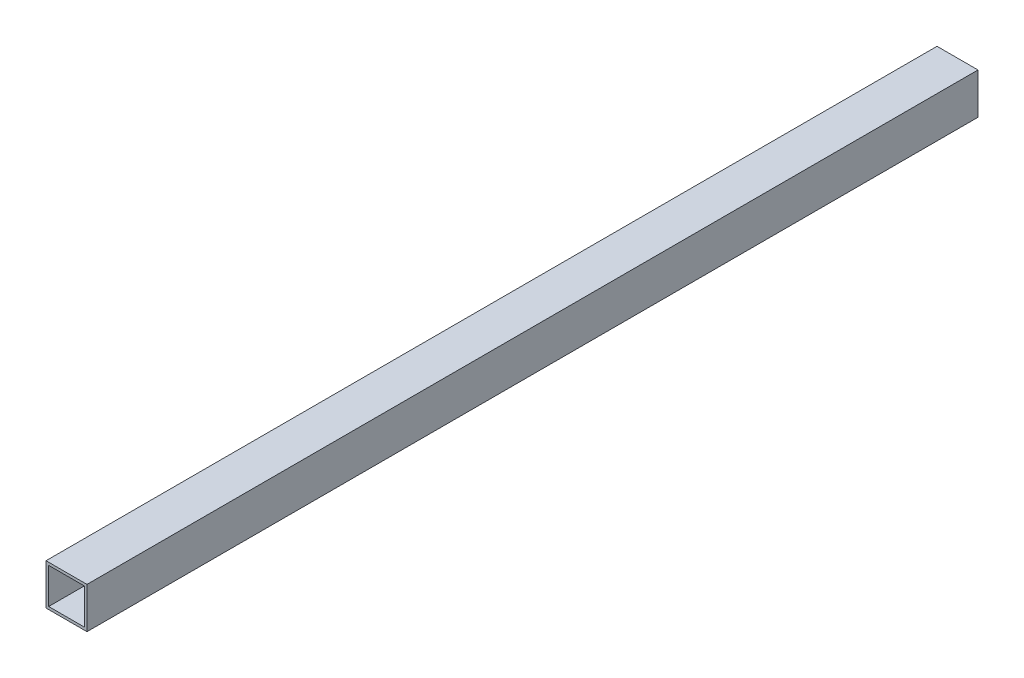
ISO-10303-21;
HEADER;
FILE_DESCRIPTION(('STEP AP214'),'2;1');
FILE_NAME('part.step','',(''),(''),'','','');
FILE_SCHEMA(('AUTOMOTIVE_DESIGN { 1 0 10303 214 1 1 1 1 }'));
ENDSEC;
DATA;
#1=APPLICATION_CONTEXT('core data for automotive mechanical design processes');
#2=APPLICATION_PROTOCOL_DEFINITION('international standard','automotive_design',2000,#1);
#3=PRODUCT_CONTEXT('',#1,'mechanical');
#4=PRODUCT('Part','Part','',(#3));
#5=PRODUCT_RELATED_PRODUCT_CATEGORY('part','',(#4));
#6=PRODUCT_DEFINITION_FORMATION('','',#4);
#7=PRODUCT_DEFINITION_CONTEXT('part definition',#1,'design');
#8=PRODUCT_DEFINITION('design','',#6,#7);
#9=PRODUCT_DEFINITION_SHAPE('','',#8);
#10=(LENGTH_UNIT() NAMED_UNIT(*) SI_UNIT(.MILLI.,.METRE.));
#11=(NAMED_UNIT(*) PLANE_ANGLE_UNIT() SI_UNIT($,.RADIAN.));
#12=(NAMED_UNIT(*) SI_UNIT($,.STERADIAN.) SOLID_ANGLE_UNIT());
#13=UNCERTAINTY_MEASURE_WITH_UNIT(LENGTH_MEASURE(1.E-05),#10,'distance_accuracy_value','');
#14=(GEOMETRIC_REPRESENTATION_CONTEXT(3) GLOBAL_UNCERTAINTY_ASSIGNED_CONTEXT((#13)) GLOBAL_UNIT_ASSIGNED_CONTEXT((#10,
#11,#12)) REPRESENTATION_CONTEXT('',''));
#15=CARTESIAN_POINT('',(0.,0.,0.));
#16=DIRECTION('',(0.,0.,1.));
#17=DIRECTION('',(1.,0.,0.));
#18=AXIS2_PLACEMENT_3D('',#15,#16,#17);
#19=CARTESIAN_POINT('',(0.,0.,1000.));
#20=DIRECTION('',(0.,0.,-1.));
#21=DIRECTION('',(-1.,0.,0.));
#22=AXIS2_PLACEMENT_3D('',#19,#20,#21);
#23=PLANE('',#22);
#24=DIRECTION('',(0.,-1.,0.));
#25=VECTOR('',#24,1.);
#26=CARTESIAN_POINT('',(-23.,-23.,1000.));
#27=LINE('',#26,#25);
#28=CARTESIAN_POINT('',(-23.,23.,1000.));
#29=VERTEX_POINT('',#28);
#30=CARTESIAN_POINT('',(-23.,-23.,1000.));
#31=VERTEX_POINT('',#30);
#32=EDGE_CURVE('E159',#29,#31,#27,.T.);
#33=ORIENTED_EDGE('',*,*,#32,.T.);
#34=DIRECTION('',(1.,0.,0.));
#35=VECTOR('',#34,1.);
#36=CARTESIAN_POINT('',(-23.,-23.,1000.));
#37=LINE('',#36,#35);
#38=CARTESIAN_POINT('',(23.,-23.,1000.));
#39=VERTEX_POINT('',#38);
#40=EDGE_CURVE('E163',#31,#39,#37,.T.);
#41=ORIENTED_EDGE('',*,*,#40,.T.);
#42=DIRECTION('',(0.,1.,0.));
#43=VECTOR('',#42,1.);
#44=CARTESIAN_POINT('',(23.,-23.,1000.));
#45=LINE('',#44,#43);
#46=CARTESIAN_POINT('',(23.,23.,1000.));
#47=VERTEX_POINT('',#46);
#48=EDGE_CURVE('E167',#39,#47,#45,.T.);
#49=ORIENTED_EDGE('',*,*,#48,.T.);
#50=DIRECTION('',(-1.,0.,0.));
#51=VECTOR('',#50,1.);
#52=CARTESIAN_POINT('',(-23.,23.,1000.));
#53=LINE('',#52,#51);
#54=EDGE_CURVE('E170',#47,#29,#53,.T.);
#55=ORIENTED_EDGE('',*,*,#54,.T.);
#56=EDGE_LOOP('',(#33,#41,#49,#55));
#57=FACE_BOUND('',#56,.T.);
#58=DIRECTION('',(0.,1.,0.));
#59=VECTOR('',#58,1.);
#60=CARTESIAN_POINT('',(20.,-20.,1000.));
#61=LINE('',#60,#59);
#62=CARTESIAN_POINT('',(20.,-20.,1000.));
#63=VERTEX_POINT('',#62);
#64=CARTESIAN_POINT('',(20.,20.,1000.));
#65=VERTEX_POINT('',#64);
#66=EDGE_CURVE('E111',#63,#65,#61,.T.);
#67=ORIENTED_EDGE('',*,*,#66,.F.);
#68=DIRECTION('',(1.,0.,0.));
#69=VECTOR('',#68,1.);
#70=CARTESIAN_POINT('',(-20.,-20.,1000.));
#71=LINE('',#70,#69);
#72=CARTESIAN_POINT('',(-20.,-20.,1000.));
#73=VERTEX_POINT('',#72);
#74=EDGE_CURVE('E137',#73,#63,#71,.T.);
#75=ORIENTED_EDGE('',*,*,#74,.F.);
#76=DIRECTION('',(0.,-1.,0.));
#77=VECTOR('',#76,1.);
#78=CARTESIAN_POINT('',(-20.,-20.,1000.));
#79=LINE('',#78,#77);
#80=CARTESIAN_POINT('',(-20.,20.,1000.));
#81=VERTEX_POINT('',#80);
#82=EDGE_CURVE('E133',#81,#73,#79,.T.);
#83=ORIENTED_EDGE('',*,*,#82,.F.);
#84=DIRECTION('',(-1.,0.,0.));
#85=VECTOR('',#84,1.);
#86=CARTESIAN_POINT('',(-20.,20.,1000.));
#87=LINE('',#86,#85);
#88=EDGE_CURVE('E120',#65,#81,#87,.T.);
#89=ORIENTED_EDGE('',*,*,#88,.F.);
#90=EDGE_LOOP('',(#67,#75,#83,#89));
#91=FACE_BOUND('',#90,.T.);
#92=ADVANCED_FACE('F45',(#57,#91),#23,.F.);
#93=CARTESIAN_POINT('',(0.,0.,0.));
#94=DIRECTION('',(0.,0.,-1.));
#95=DIRECTION('',(-1.,0.,0.));
#96=AXIS2_PLACEMENT_3D('',#93,#94,#95);
#97=PLANE('',#96);
#98=DIRECTION('',(0.,-1.,0.));
#99=VECTOR('',#98,1.);
#100=CARTESIAN_POINT('',(-23.,-23.,0.));
#101=LINE('',#100,#99);
#102=CARTESIAN_POINT('',(-23.,23.,0.));
#103=VERTEX_POINT('',#102);
#104=CARTESIAN_POINT('',(-23.,-23.,0.));
#105=VERTEX_POINT('',#104);
#106=EDGE_CURVE('E129',#103,#105,#101,.T.);
#107=ORIENTED_EDGE('',*,*,#106,.F.);
#108=DIRECTION('',(-1.,0.,0.));
#109=VECTOR('',#108,1.);
#110=CARTESIAN_POINT('',(-23.,23.,0.));
#111=LINE('',#110,#109);
#112=CARTESIAN_POINT('',(23.,23.,0.));
#113=VERTEX_POINT('',#112);
#114=EDGE_CURVE('E164',#113,#103,#111,.T.);
#115=ORIENTED_EDGE('',*,*,#114,.F.);
#116=DIRECTION('',(0.,1.,0.));
#117=VECTOR('',#116,1.);
#118=CARTESIAN_POINT('',(23.,-23.,0.));
#119=LINE('',#118,#117);
#120=CARTESIAN_POINT('',(23.,-23.,0.));
#121=VERTEX_POINT('',#120);
#122=EDGE_CURVE('E180',#121,#113,#119,.T.);
#123=ORIENTED_EDGE('',*,*,#122,.F.);
#124=DIRECTION('',(1.,0.,0.));
#125=VECTOR('',#124,1.);
#126=CARTESIAN_POINT('',(-23.,-23.,0.));
#127=LINE('',#126,#125);
#128=EDGE_CURVE('E177',#105,#121,#127,.T.);
#129=ORIENTED_EDGE('',*,*,#128,.F.);
#130=EDGE_LOOP('',(#107,#115,#123,#129));
#131=FACE_BOUND('',#130,.T.);
#132=DIRECTION('',(1.,0.,0.));
#133=VECTOR('',#132,1.);
#134=CARTESIAN_POINT('',(-20.,-20.,0.));
#135=LINE('',#134,#133);
#136=CARTESIAN_POINT('',(-20.,-20.,0.));
#137=VERTEX_POINT('',#136);
#138=CARTESIAN_POINT('',(20.,-20.,0.));
#139=VERTEX_POINT('',#138);
#140=EDGE_CURVE('E121',#137,#139,#135,.T.);
#141=ORIENTED_EDGE('',*,*,#140,.T.);
#142=DIRECTION('',(0.,1.,0.));
#143=VECTOR('',#142,1.);
#144=CARTESIAN_POINT('',(20.,-20.,0.));
#145=LINE('',#144,#143);
#146=CARTESIAN_POINT('',(20.,20.,0.));
#147=VERTEX_POINT('',#146);
#148=EDGE_CURVE('E69',#139,#147,#145,.T.);
#149=ORIENTED_EDGE('',*,*,#148,.T.);
#150=DIRECTION('',(-1.,0.,0.));
#151=VECTOR('',#150,1.);
#152=CARTESIAN_POINT('',(-20.,20.,0.));
#153=LINE('',#152,#151);
#154=CARTESIAN_POINT('',(-20.,20.,0.));
#155=VERTEX_POINT('',#154);
#156=EDGE_CURVE('E127',#147,#155,#153,.T.);
#157=ORIENTED_EDGE('',*,*,#156,.T.);
#158=DIRECTION('',(0.,-1.,0.));
#159=VECTOR('',#158,1.);
#160=CARTESIAN_POINT('',(-20.,-20.,0.));
#161=LINE('',#160,#159);
#162=EDGE_CURVE('E146',#155,#137,#161,.T.);
#163=ORIENTED_EDGE('',*,*,#162,.T.);
#164=EDGE_LOOP('',(#141,#149,#157,#163));
#165=FACE_BOUND('',#164,.T.);
#166=ADVANCED_FACE('F203',(#131,#165),#97,.T.);
#167=CARTESIAN_POINT('',(-23.,-23.,1000.));
#168=DIRECTION('',(1.,0.,0.));
#169=DIRECTION('',(0.,0.,-1.));
#170=AXIS2_PLACEMENT_3D('',#167,#168,#169);
#171=PLANE('',#170);
#172=ORIENTED_EDGE('',*,*,#106,.T.);
#173=DIRECTION('',(0.,0.,-1.));
#174=VECTOR('',#173,1.);
#175=CARTESIAN_POINT('',(-23.,-23.,1000.));
#176=LINE('',#175,#174);
#177=EDGE_CURVE('E11',#31,#105,#176,.T.);
#178=ORIENTED_EDGE('',*,*,#177,.F.);
#179=ORIENTED_EDGE('',*,*,#32,.F.);
#180=DIRECTION('',(0.,0.,-1.));
#181=VECTOR('',#180,1.);
#182=CARTESIAN_POINT('',(-23.,23.,1000.));
#183=LINE('',#182,#181);
#184=EDGE_CURVE('E173',#29,#103,#183,.T.);
#185=ORIENTED_EDGE('',*,*,#184,.T.);
#186=EDGE_LOOP('',(#172,#178,#179,#185));
#187=FACE_BOUND('',#186,.T.);
#188=ADVANCED_FACE('F47',(#187),#171,.F.);
#189=CARTESIAN_POINT('',(-23.,-23.,1000.));
#190=DIRECTION('',(0.,1.,0.));
#191=DIRECTION('',(0.,0.,1.));
#192=AXIS2_PLACEMENT_3D('',#189,#190,#191);
#193=PLANE('',#192);
#194=ORIENTED_EDGE('',*,*,#128,.T.);
#195=DIRECTION('',(0.,0.,-1.));
#196=VECTOR('',#195,1.);
#197=CARTESIAN_POINT('',(23.,-23.,1000.));
#198=LINE('',#197,#196);
#199=EDGE_CURVE('E54',#39,#121,#198,.T.);
#200=ORIENTED_EDGE('',*,*,#199,.F.);
#201=ORIENTED_EDGE('',*,*,#40,.F.);
#202=ORIENTED_EDGE('',*,*,#177,.T.);
#203=EDGE_LOOP('',(#194,#200,#201,#202));
#204=FACE_BOUND('',#203,.T.);
#205=ADVANCED_FACE('F213',(#204),#193,.F.);
#206=CARTESIAN_POINT('',(23.,-23.,1000.));
#207=DIRECTION('',(-1.,0.,0.));
#208=DIRECTION('',(0.,-1.,0.));
#209=AXIS2_PLACEMENT_3D('',#206,#207,#208);
#210=PLANE('',#209);
#211=ORIENTED_EDGE('',*,*,#122,.T.);
#212=DIRECTION('',(0.,0.,-1.));
#213=VECTOR('',#212,1.);
#214=CARTESIAN_POINT('',(23.,23.,1000.));
#215=LINE('',#214,#213);
#216=EDGE_CURVE('E188',#47,#113,#215,.T.);
#217=ORIENTED_EDGE('',*,*,#216,.F.);
#218=ORIENTED_EDGE('',*,*,#48,.F.);
#219=ORIENTED_EDGE('',*,*,#199,.T.);
#220=EDGE_LOOP('',(#211,#217,#218,#219));
#221=FACE_BOUND('',#220,.T.);
#222=ADVANCED_FACE('F197',(#221),#210,.F.);
#223=CARTESIAN_POINT('',(-23.,23.,1000.));
#224=DIRECTION('',(0.,-1.,0.));
#225=DIRECTION('',(1.,0.,0.));
#226=AXIS2_PLACEMENT_3D('',#223,#224,#225);
#227=PLANE('',#226);
#228=ORIENTED_EDGE('',*,*,#114,.T.);
#229=ORIENTED_EDGE('',*,*,#184,.F.);
#230=ORIENTED_EDGE('',*,*,#54,.F.);
#231=ORIENTED_EDGE('',*,*,#216,.T.);
#232=EDGE_LOOP('',(#228,#229,#230,#231));
#233=FACE_BOUND('',#232,.T.);
#234=ADVANCED_FACE('F207',(#233),#227,.F.);
#235=CARTESIAN_POINT('',(20.,-20.,1000.));
#236=DIRECTION('',(-1.,0.,0.));
#237=DIRECTION('',(0.,0.,1.));
#238=AXIS2_PLACEMENT_3D('',#235,#236,#237);
#239=PLANE('',#238);
#240=ORIENTED_EDGE('',*,*,#148,.F.);
#241=DIRECTION('',(0.,0.,-1.));
#242=VECTOR('',#241,1.);
#243=CARTESIAN_POINT('',(20.,-20.,1000.));
#244=LINE('',#243,#242);
#245=EDGE_CURVE('E115',#63,#139,#244,.T.);
#246=ORIENTED_EDGE('',*,*,#245,.F.);
#247=ORIENTED_EDGE('',*,*,#66,.T.);
#248=DIRECTION('',(0.,0.,-1.));
#249=VECTOR('',#248,1.);
#250=CARTESIAN_POINT('',(20.,20.,1000.));
#251=LINE('',#250,#249);
#252=EDGE_CURVE('E114',#65,#147,#251,.T.);
#253=ORIENTED_EDGE('',*,*,#252,.T.);
#254=EDGE_LOOP('',(#240,#246,#247,#253));
#255=FACE_BOUND('',#254,.T.);
#256=ADVANCED_FACE('F113',(#255),#239,.T.);
#257=CARTESIAN_POINT('',(-20.,20.,1000.));
#258=DIRECTION('',(0.,-1.,0.));
#259=DIRECTION('',(0.,0.,-1.));
#260=AXIS2_PLACEMENT_3D('',#257,#258,#259);
#261=PLANE('',#260);
#262=ORIENTED_EDGE('',*,*,#156,.F.);
#263=ORIENTED_EDGE('',*,*,#252,.F.);
#264=ORIENTED_EDGE('',*,*,#88,.T.);
#265=DIRECTION('',(0.,0.,-1.));
#266=VECTOR('',#265,1.);
#267=CARTESIAN_POINT('',(-20.,20.,1000.));
#268=LINE('',#267,#266);
#269=EDGE_CURVE('E130',#81,#155,#268,.T.);
#270=ORIENTED_EDGE('',*,*,#269,.T.);
#271=EDGE_LOOP('',(#262,#263,#264,#270));
#272=FACE_BOUND('',#271,.T.);
#273=ADVANCED_FACE('F124',(#272),#261,.T.);
#274=CARTESIAN_POINT('',(-20.,-20.,1000.));
#275=DIRECTION('',(1.,0.,0.));
#276=DIRECTION('',(0.,0.,-1.));
#277=AXIS2_PLACEMENT_3D('',#274,#275,#276);
#278=PLANE('',#277);
#279=ORIENTED_EDGE('',*,*,#162,.F.);
#280=ORIENTED_EDGE('',*,*,#269,.F.);
#281=ORIENTED_EDGE('',*,*,#82,.T.);
#282=DIRECTION('',(0.,0.,-1.));
#283=VECTOR('',#282,1.);
#284=CARTESIAN_POINT('',(-20.,-20.,1000.));
#285=LINE('',#284,#283);
#286=EDGE_CURVE('E61',#73,#137,#285,.T.);
#287=ORIENTED_EDGE('',*,*,#286,.T.);
#288=EDGE_LOOP('',(#279,#280,#281,#287));
#289=FACE_BOUND('',#288,.T.);
#290=ADVANCED_FACE('F236',(#289),#278,.T.);
#291=CARTESIAN_POINT('',(-20.,-20.,1000.));
#292=DIRECTION('',(0.,1.,0.));
#293=DIRECTION('',(0.,0.,1.));
#294=AXIS2_PLACEMENT_3D('',#291,#292,#293);
#295=PLANE('',#294);
#296=ORIENTED_EDGE('',*,*,#140,.F.);
#297=ORIENTED_EDGE('',*,*,#286,.F.);
#298=ORIENTED_EDGE('',*,*,#74,.T.);
#299=ORIENTED_EDGE('',*,*,#245,.T.);
#300=EDGE_LOOP('',(#296,#297,#298,#299));
#301=FACE_BOUND('',#300,.T.);
#302=ADVANCED_FACE('F240',(#301),#295,.T.);
#303=CLOSED_SHELL('',(#92,#166,#188,#205,#222,#234,#256,#273,#290,#302));
#304=MANIFOLD_SOLID_BREP('B2',#303);
#305=ADVANCED_BREP_SHAPE_REPRESENTATION('',(#18,#304),#14);
#306=SHAPE_DEFINITION_REPRESENTATION(#9,#305);
ENDSEC;
END-ISO-10303-21;
